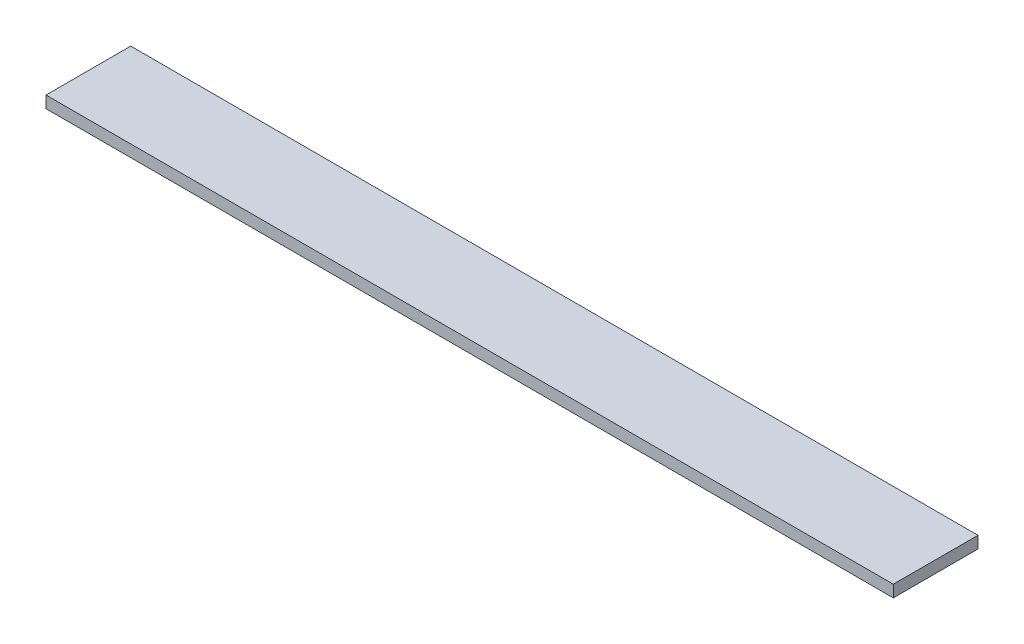
ISO-10303-21;
HEADER;
FILE_DESCRIPTION(('STEP AP214'),'2;1');
FILE_NAME('part.step','',(''),(''),'','','');
FILE_SCHEMA(('AUTOMOTIVE_DESIGN { 1 0 10303 214 1 1 1 1 }'));
ENDSEC;
DATA;
#1=APPLICATION_CONTEXT('core data for automotive mechanical design processes');
#2=APPLICATION_PROTOCOL_DEFINITION('international standard','automotive_design',2000,#1);
#3=PRODUCT_CONTEXT('',#1,'mechanical');
#4=PRODUCT('Part','Part','',(#3));
#5=PRODUCT_RELATED_PRODUCT_CATEGORY('part','',(#4));
#6=PRODUCT_DEFINITION_FORMATION('','',#4);
#7=PRODUCT_DEFINITION_CONTEXT('part definition',#1,'design');
#8=PRODUCT_DEFINITION('design','',#6,#7);
#9=PRODUCT_DEFINITION_SHAPE('','',#8);
#10=(LENGTH_UNIT() NAMED_UNIT(*) SI_UNIT(.MILLI.,.METRE.));
#11=(NAMED_UNIT(*) PLANE_ANGLE_UNIT() SI_UNIT($,.RADIAN.));
#12=(NAMED_UNIT(*) SI_UNIT($,.STERADIAN.) SOLID_ANGLE_UNIT());
#13=UNCERTAINTY_MEASURE_WITH_UNIT(LENGTH_MEASURE(1.E-05),#10,'distance_accuracy_value','');
#14=(GEOMETRIC_REPRESENTATION_CONTEXT(3) GLOBAL_UNCERTAINTY_ASSIGNED_CONTEXT((#13)) GLOBAL_UNIT_ASSIGNED_CONTEXT((#10,
#11,#12)) REPRESENTATION_CONTEXT('',''));
#15=CARTESIAN_POINT('',(0.,0.,0.));
#16=DIRECTION('',(0.,0.,1.));
#17=DIRECTION('',(1.,0.,0.));
#18=AXIS2_PLACEMENT_3D('',#15,#16,#17);
#19=CARTESIAN_POINT('',(25.,0.7,2.5));
#20=DIRECTION('',(-1.,0.,0.));
#21=DIRECTION('',(0.,0.,1.));
#22=AXIS2_PLACEMENT_3D('',#19,#20,#21);
#23=PLANE('',#22);
#24=DIRECTION('',(0.,0.,-1.));
#25=VECTOR('',#24,1.);
#26=CARTESIAN_POINT('',(25.,0.,2.5));
#27=LINE('',#26,#25);
#28=CARTESIAN_POINT('',(25.,0.,2.5));
#29=VERTEX_POINT('',#28);
#30=CARTESIAN_POINT('',(25.,0.,-2.5));
#31=VERTEX_POINT('',#30);
#32=EDGE_CURVE('E96',#29,#31,#27,.T.);
#33=ORIENTED_EDGE('',*,*,#32,.T.);
#34=DIRECTION('',(0.,-1.,0.));
#35=VECTOR('',#34,1.);
#36=CARTESIAN_POINT('',(25.,0.7,-2.5));
#37=LINE('',#36,#35);
#38=CARTESIAN_POINT('',(25.,0.7,-2.5));
#39=VERTEX_POINT('',#38);
#40=EDGE_CURVE('E11',#39,#31,#37,.T.);
#41=ORIENTED_EDGE('',*,*,#40,.F.);
#42=DIRECTION('',(0.,0.,-1.));
#43=VECTOR('',#42,1.);
#44=CARTESIAN_POINT('',(25.,0.7,2.5));
#45=LINE('',#44,#43);
#46=CARTESIAN_POINT('',(25.,0.7,2.5));
#47=VERTEX_POINT('',#46);
#48=EDGE_CURVE('E84',#47,#39,#45,.T.);
#49=ORIENTED_EDGE('',*,*,#48,.F.);
#50=DIRECTION('',(0.,-1.,0.));
#51=VECTOR('',#50,1.);
#52=CARTESIAN_POINT('',(25.,0.7,2.5));
#53=LINE('',#52,#51);
#54=EDGE_CURVE('E92',#47,#29,#53,.T.);
#55=ORIENTED_EDGE('',*,*,#54,.T.);
#56=EDGE_LOOP('',(#33,#41,#49,#55));
#57=FACE_BOUND('',#56,.T.);
#58=ADVANCED_FACE('F33',(#57),#23,.F.);
#59=CARTESIAN_POINT('',(-25.,0.7,-2.5));
#60=DIRECTION('',(0.,0.,1.));
#61=DIRECTION('',(1.,0.,0.));
#62=AXIS2_PLACEMENT_3D('',#59,#60,#61);
#63=PLANE('',#62);
#64=DIRECTION('',(-1.,0.,0.));
#65=VECTOR('',#64,1.);
#66=CARTESIAN_POINT('',(-25.,0.,-2.5));
#67=LINE('',#66,#65);
#68=CARTESIAN_POINT('',(-25.,0.,-2.5));
#69=VERTEX_POINT('',#68);
#70=EDGE_CURVE('E88',#31,#69,#67,.T.);
#71=ORIENTED_EDGE('',*,*,#70,.T.);
#72=DIRECTION('',(0.,-1.,0.));
#73=VECTOR('',#72,1.);
#74=CARTESIAN_POINT('',(-25.,0.7,-2.5));
#75=LINE('',#74,#73);
#76=CARTESIAN_POINT('',(-25.,0.7,-2.5));
#77=VERTEX_POINT('',#76);
#78=EDGE_CURVE('E41',#77,#69,#75,.T.);
#79=ORIENTED_EDGE('',*,*,#78,.F.);
#80=DIRECTION('',(-1.,0.,0.));
#81=VECTOR('',#80,1.);
#82=CARTESIAN_POINT('',(-25.,0.7,-2.5));
#83=LINE('',#82,#81);
#84=EDGE_CURVE('E79',#39,#77,#83,.T.);
#85=ORIENTED_EDGE('',*,*,#84,.F.);
#86=ORIENTED_EDGE('',*,*,#40,.T.);
#87=EDGE_LOOP('',(#71,#79,#85,#86));
#88=FACE_BOUND('',#87,.T.);
#89=ADVANCED_FACE('F87',(#88),#63,.F.);
#90=CARTESIAN_POINT('',(-25.,0.7,2.5));
#91=DIRECTION('',(1.,0.,0.));
#92=DIRECTION('',(0.,0.,-1.));
#93=AXIS2_PLACEMENT_3D('',#90,#91,#92);
#94=PLANE('',#93);
#95=DIRECTION('',(0.,0.,1.));
#96=VECTOR('',#95,1.);
#97=CARTESIAN_POINT('',(-25.,0.,2.5));
#98=LINE('',#97,#96);
#99=CARTESIAN_POINT('',(-25.,0.,2.5));
#100=VERTEX_POINT('',#99);
#101=EDGE_CURVE('E66',#69,#100,#98,.T.);
#102=ORIENTED_EDGE('',*,*,#101,.T.);
#103=DIRECTION('',(0.,-1.,0.));
#104=VECTOR('',#103,1.);
#105=CARTESIAN_POINT('',(-25.,0.7,2.5));
#106=LINE('',#105,#104);
#107=CARTESIAN_POINT('',(-25.,0.7,2.5));
#108=VERTEX_POINT('',#107);
#109=EDGE_CURVE('E89',#108,#100,#106,.T.);
#110=ORIENTED_EDGE('',*,*,#109,.F.);
#111=DIRECTION('',(0.,0.,1.));
#112=VECTOR('',#111,1.);
#113=CARTESIAN_POINT('',(-25.,0.7,2.5));
#114=LINE('',#113,#112);
#115=EDGE_CURVE('E82',#77,#108,#114,.T.);
#116=ORIENTED_EDGE('',*,*,#115,.F.);
#117=ORIENTED_EDGE('',*,*,#78,.T.);
#118=EDGE_LOOP('',(#102,#110,#116,#117));
#119=FACE_BOUND('',#118,.T.);
#120=ADVANCED_FACE('F90',(#119),#94,.F.);
#121=CARTESIAN_POINT('',(-25.,0.7,2.5));
#122=DIRECTION('',(0.,0.,-1.));
#123=DIRECTION('',(-1.,0.,0.));
#124=AXIS2_PLACEMENT_3D('',#121,#122,#123);
#125=PLANE('',#124);
#126=DIRECTION('',(1.,0.,0.));
#127=VECTOR('',#126,1.);
#128=CARTESIAN_POINT('',(-25.,0.,2.5));
#129=LINE('',#128,#127);
#130=EDGE_CURVE('E72',#100,#29,#129,.T.);
#131=ORIENTED_EDGE('',*,*,#130,.T.);
#132=ORIENTED_EDGE('',*,*,#54,.F.);
#133=DIRECTION('',(1.,0.,0.));
#134=VECTOR('',#133,1.);
#135=CARTESIAN_POINT('',(-25.,0.7,2.5));
#136=LINE('',#135,#134);
#137=EDGE_CURVE('E49',#108,#47,#136,.T.);
#138=ORIENTED_EDGE('',*,*,#137,.F.);
#139=ORIENTED_EDGE('',*,*,#109,.T.);
#140=EDGE_LOOP('',(#131,#132,#138,#139));
#141=FACE_BOUND('',#140,.T.);
#142=ADVANCED_FACE('F103',(#141),#125,.F.);
#143=CARTESIAN_POINT('',(0.,0.7,0.));
#144=DIRECTION('',(0.,-1.,0.));
#145=DIRECTION('',(0.,0.,-1.));
#146=AXIS2_PLACEMENT_3D('',#143,#144,#145);
#147=PLANE('',#146);
#148=ORIENTED_EDGE('',*,*,#48,.T.);
#149=ORIENTED_EDGE('',*,*,#84,.T.);
#150=ORIENTED_EDGE('',*,*,#115,.T.);
#151=ORIENTED_EDGE('',*,*,#137,.T.);
#152=EDGE_LOOP('',(#148,#149,#150,#151));
#153=FACE_BOUND('',#152,.T.);
#154=ADVANCED_FACE('F80',(#153),#147,.F.);
#155=CARTESIAN_POINT('',(0.,0.,0.));
#156=DIRECTION('',(0.,-1.,0.));
#157=DIRECTION('',(0.,0.,-1.));
#158=AXIS2_PLACEMENT_3D('',#155,#156,#157);
#159=PLANE('',#158);
#160=ORIENTED_EDGE('',*,*,#32,.F.);
#161=ORIENTED_EDGE('',*,*,#130,.F.);
#162=ORIENTED_EDGE('',*,*,#101,.F.);
#163=ORIENTED_EDGE('',*,*,#70,.F.);
#164=EDGE_LOOP('',(#160,#161,#162,#163));
#165=FACE_BOUND('',#164,.T.);
#166=ADVANCED_FACE('F106',(#165),#159,.T.);
#167=CLOSED_SHELL('',(#58,#89,#120,#142,#154,#166));
#168=MANIFOLD_SOLID_BREP('B2',#167);
#169=ADVANCED_BREP_SHAPE_REPRESENTATION('',(#18,#168),#14);
#170=SHAPE_DEFINITION_REPRESENTATION(#9,#169);
ENDSEC;
END-ISO-10303-21;
